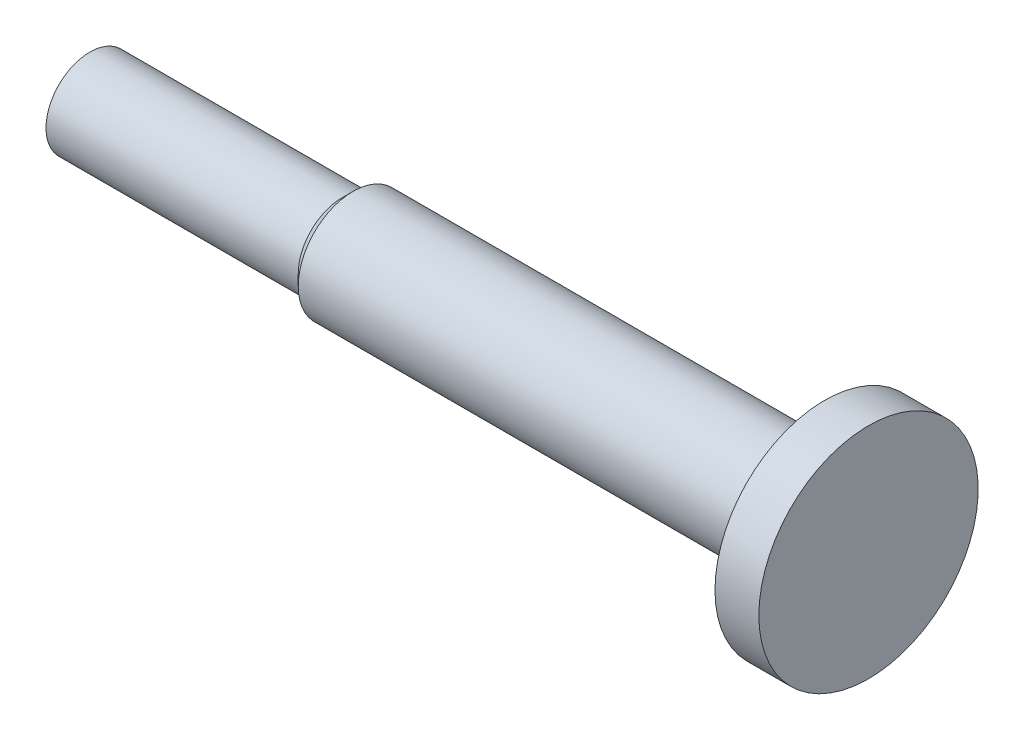
ISO-10303-21;
HEADER;
FILE_DESCRIPTION(('STEP AP214'),'2;1');
FILE_NAME('part.step','',(''),(''),'','','');
FILE_SCHEMA(('AUTOMOTIVE_DESIGN { 1 0 10303 214 1 1 1 1 }'));
ENDSEC;
DATA;
#1=APPLICATION_CONTEXT('core data for automotive mechanical design processes');
#2=APPLICATION_PROTOCOL_DEFINITION('international standard','automotive_design',2000,#1);
#3=PRODUCT_CONTEXT('',#1,'mechanical');
#4=PRODUCT('Part','Part','',(#3));
#5=PRODUCT_RELATED_PRODUCT_CATEGORY('part','',(#4));
#6=PRODUCT_DEFINITION_FORMATION('','',#4);
#7=PRODUCT_DEFINITION_CONTEXT('part definition',#1,'design');
#8=PRODUCT_DEFINITION('design','',#6,#7);
#9=PRODUCT_DEFINITION_SHAPE('','',#8);
#10=(LENGTH_UNIT() NAMED_UNIT(*) SI_UNIT(.MILLI.,.METRE.));
#11=(NAMED_UNIT(*) PLANE_ANGLE_UNIT() SI_UNIT($,.RADIAN.));
#12=(NAMED_UNIT(*) SI_UNIT($,.STERADIAN.) SOLID_ANGLE_UNIT());
#13=UNCERTAINTY_MEASURE_WITH_UNIT(LENGTH_MEASURE(1.E-05),#10,'distance_accuracy_value','');
#14=(GEOMETRIC_REPRESENTATION_CONTEXT(3) GLOBAL_UNCERTAINTY_ASSIGNED_CONTEXT((#13)) GLOBAL_UNIT_ASSIGNED_CONTEXT((#10,
#11,#12)) REPRESENTATION_CONTEXT('',''));
#15=CARTESIAN_POINT('',(0.,0.,0.));
#16=DIRECTION('',(0.,0.,1.));
#17=DIRECTION('',(1.,0.,0.));
#18=AXIS2_PLACEMENT_3D('',#15,#16,#17);
#19=CARTESIAN_POINT('',(-12.,0.,0.));
#20=DIRECTION('',(1.,0.,0.));
#21=DIRECTION('',(0.,0.,-1.));
#22=AXIS2_PLACEMENT_3D('',#19,#20,#21);
#23=PLANE('',#22);
#24=CARTESIAN_POINT('',(-12.,0.,0.));
#25=DIRECTION('',(-1.,0.,0.));
#26=DIRECTION('',(0.,0.,1.));
#27=AXIS2_PLACEMENT_3D('',#24,#25,#26);
#28=CIRCLE('',#27,2.);
#29=CARTESIAN_POINT('',(-12.,0.,2.));
#30=VERTEX_POINT('',#29);
#31=EDGE_CURVE('E10',#30,#30,#28,.T.);
#32=ORIENTED_EDGE('',*,*,#31,.T.);
#33=EDGE_LOOP('',(#32));
#34=FACE_BOUND('',#33,.T.);
#35=ADVANCED_FACE('F36',(#34),#23,.F.);
#36=CARTESIAN_POINT('',(23.5,0.,0.));
#37=DIRECTION('',(-1.,0.,0.));
#38=DIRECTION('',(0.,0.,1.));
#39=AXIS2_PLACEMENT_3D('',#36,#37,#38);
#40=CYLINDRICAL_SURFACE('',#39,2.);
#41=ORIENTED_EDGE('',*,*,#31,.F.);
#42=EDGE_LOOP('',(#41));
#43=FACE_BOUND('',#42,.T.);
#44=CARTESIAN_POINT('',(-0.5,0.,0.));
#45=DIRECTION('',(-1.,0.,0.));
#46=DIRECTION('',(0.,0.,1.));
#47=AXIS2_PLACEMENT_3D('',#44,#45,#46);
#48=CIRCLE('',#47,2.);
#49=CARTESIAN_POINT('',(-0.5,0.,2.));
#50=VERTEX_POINT('',#49);
#51=EDGE_CURVE('E42',#50,#50,#48,.T.);
#52=ORIENTED_EDGE('',*,*,#51,.T.);
#53=EDGE_LOOP('',(#52));
#54=FACE_BOUND('',#53,.T.);
#55=ADVANCED_FACE('F74',(#43,#54),#40,.T.);
#56=CARTESIAN_POINT('',(0.,0.,0.));
#57=DIRECTION('',(1.,0.,0.));
#58=DIRECTION('',(0.,0.,-1.));
#59=AXIS2_PLACEMENT_3D('',#56,#57,#58);
#60=CONICAL_SURFACE('',#59,2.5,0.785398163397448);
#61=ORIENTED_EDGE('',*,*,#51,.F.);
#62=EDGE_LOOP('',(#61));
#63=FACE_BOUND('',#62,.T.);
#64=CARTESIAN_POINT('',(0.,0.,0.));
#65=DIRECTION('',(-1.,0.,0.));
#66=DIRECTION('',(0.,0.,1.));
#67=AXIS2_PLACEMENT_3D('',#64,#65,#66);
#68=CIRCLE('',#67,2.5);
#69=CARTESIAN_POINT('',(0.,0.,2.5));
#70=VERTEX_POINT('',#69);
#71=EDGE_CURVE('E46',#70,#70,#68,.T.);
#72=ORIENTED_EDGE('',*,*,#71,.T.);
#73=EDGE_LOOP('',(#72));
#74=FACE_BOUND('',#73,.T.);
#75=ADVANCED_FACE('F78',(#63,#74),#60,.T.);
#76=CARTESIAN_POINT('',(23.5,0.,0.));
#77=DIRECTION('',(-1.,0.,0.));
#78=DIRECTION('',(0.,0.,1.));
#79=AXIS2_PLACEMENT_3D('',#76,#77,#78);
#80=CYLINDRICAL_SURFACE('',#79,2.5);
#81=ORIENTED_EDGE('',*,*,#71,.F.);
#82=EDGE_LOOP('',(#81));
#83=FACE_BOUND('',#82,.T.);
#84=CARTESIAN_POINT('',(21.5,0.,0.));
#85=DIRECTION('',(-1.,0.,0.));
#86=DIRECTION('',(0.,0.,1.));
#87=AXIS2_PLACEMENT_3D('',#84,#85,#86);
#88=CIRCLE('',#87,2.5);
#89=CARTESIAN_POINT('',(21.5,0.,2.5));
#90=VERTEX_POINT('',#89);
#91=EDGE_CURVE('E50',#90,#90,#88,.T.);
#92=ORIENTED_EDGE('',*,*,#91,.T.);
#93=EDGE_LOOP('',(#92));
#94=FACE_BOUND('',#93,.T.);
#95=ADVANCED_FACE('F83',(#83,#94),#80,.T.);
#96=CARTESIAN_POINT('',(21.5,2.5,0.));
#97=DIRECTION('',(1.,0.,0.));
#98=DIRECTION('',(0.,0.,-1.));
#99=AXIS2_PLACEMENT_3D('',#96,#97,#98);
#100=PLANE('',#99);
#101=ORIENTED_EDGE('',*,*,#91,.F.);
#102=EDGE_LOOP('',(#101));
#103=FACE_BOUND('',#102,.T.);
#104=CARTESIAN_POINT('',(21.5,0.,0.));
#105=DIRECTION('',(-1.,0.,0.));
#106=DIRECTION('',(0.,0.,1.));
#107=AXIS2_PLACEMENT_3D('',#104,#105,#106);
#108=CIRCLE('',#107,5.);
#109=CARTESIAN_POINT('',(21.5,0.,5.));
#110=VERTEX_POINT('',#109);
#111=EDGE_CURVE('E55',#110,#110,#108,.T.);
#112=ORIENTED_EDGE('',*,*,#111,.T.);
#113=EDGE_LOOP('',(#112));
#114=FACE_BOUND('',#113,.T.);
#115=ADVANCED_FACE('F70',(#103,#114),#100,.F.);
#116=CARTESIAN_POINT('',(23.5,0.,0.));
#117=DIRECTION('',(-1.,0.,0.));
#118=DIRECTION('',(0.,0.,1.));
#119=AXIS2_PLACEMENT_3D('',#116,#117,#118);
#120=CYLINDRICAL_SURFACE('',#119,5.);
#121=ORIENTED_EDGE('',*,*,#111,.F.);
#122=EDGE_LOOP('',(#121));
#123=FACE_BOUND('',#122,.T.);
#124=CARTESIAN_POINT('',(23.5,0.,0.));
#125=DIRECTION('',(-1.,0.,0.));
#126=DIRECTION('',(0.,0.,1.));
#127=AXIS2_PLACEMENT_3D('',#124,#125,#126);
#128=CIRCLE('',#127,5.);
#129=CARTESIAN_POINT('',(23.5,0.,5.));
#130=VERTEX_POINT('',#129);
#131=EDGE_CURVE('E58',#130,#130,#128,.T.);
#132=ORIENTED_EDGE('',*,*,#131,.T.);
#133=EDGE_LOOP('',(#132));
#134=FACE_BOUND('',#133,.T.);
#135=ADVANCED_FACE('F62',(#123,#134),#120,.T.);
#136=CARTESIAN_POINT('',(23.5,5.,0.));
#137=DIRECTION('',(-1.,0.,0.));
#138=DIRECTION('',(0.,0.,1.));
#139=AXIS2_PLACEMENT_3D('',#136,#137,#138);
#140=PLANE('',#139);
#141=ORIENTED_EDGE('',*,*,#131,.F.);
#142=EDGE_LOOP('',(#141));
#143=FACE_BOUND('',#142,.T.);
#144=ADVANCED_FACE('F64',(#143),#140,.F.);
#145=CLOSED_SHELL('',(#35,#55,#75,#95,#115,#135,#144));
#146=MANIFOLD_SOLID_BREP('B2',#145);
#147=ADVANCED_BREP_SHAPE_REPRESENTATION('',(#18,#146),#14);
#148=SHAPE_DEFINITION_REPRESENTATION(#9,#147);
ENDSEC;
END-ISO-10303-21;
